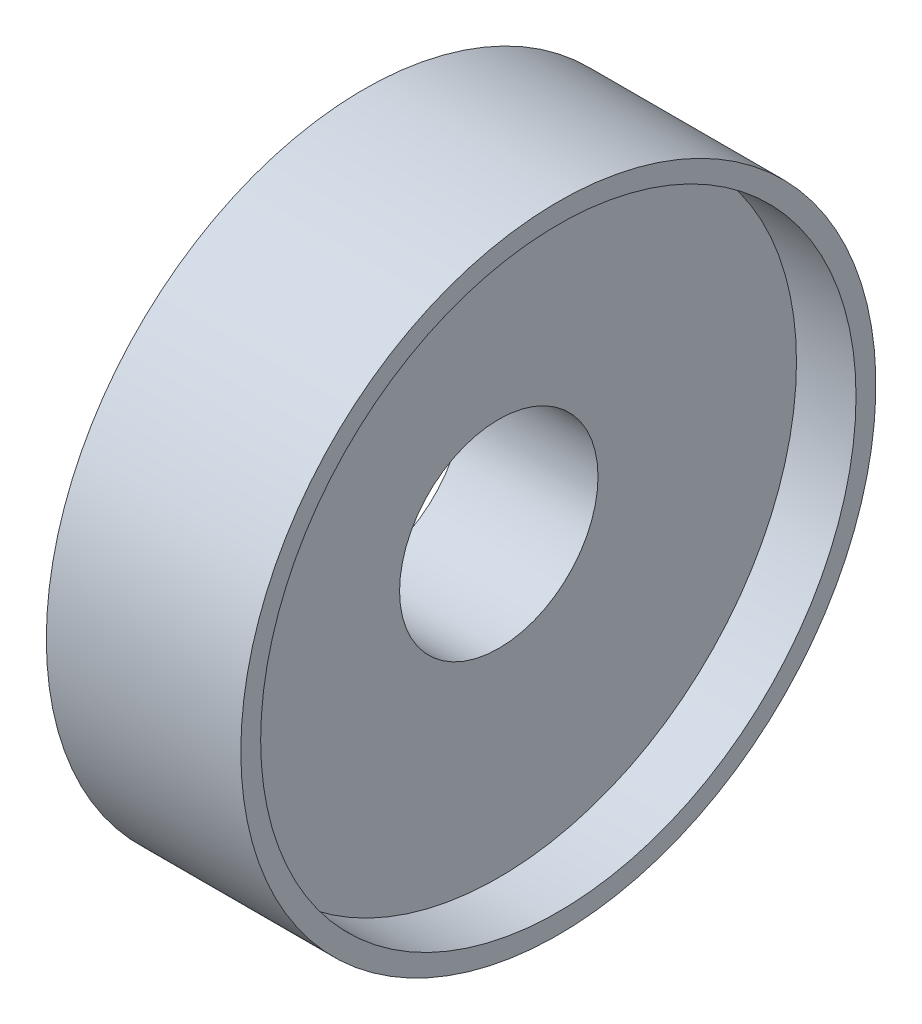
ISO-10303-21;
HEADER;
FILE_DESCRIPTION(('STEP AP214'),'2;1');
FILE_NAME('part.step','',(''),(''),'','','');
FILE_SCHEMA(('AUTOMOTIVE_DESIGN { 1 0 10303 214 1 1 1 1 }'));
ENDSEC;
DATA;
#1=APPLICATION_CONTEXT('core data for automotive mechanical design processes');
#2=APPLICATION_PROTOCOL_DEFINITION('international standard','automotive_design',2000,#1);
#3=PRODUCT_CONTEXT('',#1,'mechanical');
#4=PRODUCT('Part','Part','',(#3));
#5=PRODUCT_RELATED_PRODUCT_CATEGORY('part','',(#4));
#6=PRODUCT_DEFINITION_FORMATION('','',#4);
#7=PRODUCT_DEFINITION_CONTEXT('part definition',#1,'design');
#8=PRODUCT_DEFINITION('design','',#6,#7);
#9=PRODUCT_DEFINITION_SHAPE('','',#8);
#10=(LENGTH_UNIT() NAMED_UNIT(*) SI_UNIT(.MILLI.,.METRE.));
#11=(NAMED_UNIT(*) PLANE_ANGLE_UNIT() SI_UNIT($,.RADIAN.));
#12=(NAMED_UNIT(*) SI_UNIT($,.STERADIAN.) SOLID_ANGLE_UNIT());
#13=UNCERTAINTY_MEASURE_WITH_UNIT(LENGTH_MEASURE(1.E-05),#10,'distance_accuracy_value','');
#14=(GEOMETRIC_REPRESENTATION_CONTEXT(3) GLOBAL_UNCERTAINTY_ASSIGNED_CONTEXT((#13)) GLOBAL_UNIT_ASSIGNED_CONTEXT((#10,
#11,#12)) REPRESENTATION_CONTEXT('',''));
#15=CARTESIAN_POINT('',(0.,0.,0.));
#16=DIRECTION('',(0.,0.,1.));
#17=DIRECTION('',(1.,0.,0.));
#18=AXIS2_PLACEMENT_3D('',#15,#16,#17);
#19=CARTESIAN_POINT('',(21.45,0.,0.));
#20=DIRECTION('',(-1.,0.,0.));
#21=DIRECTION('',(0.,0.,1.));
#22=AXIS2_PLACEMENT_3D('',#19,#20,#21);
#23=CYLINDRICAL_SURFACE('',#22,7.5);
#24=CARTESIAN_POINT('',(20.7,0.,0.));
#25=DIRECTION('',(-1.,0.,0.));
#26=DIRECTION('',(0.,0.,1.));
#27=AXIS2_PLACEMENT_3D('',#24,#25,#26);
#28=CIRCLE('',#27,7.5);
#29=CARTESIAN_POINT('',(20.7,0.,7.5));
#30=VERTEX_POINT('',#29);
#31=EDGE_CURVE('E33',#30,#30,#28,.F.);
#32=ORIENTED_EDGE('',*,*,#31,.F.);
#33=EDGE_LOOP('',(#32));
#34=FACE_BOUND('',#33,.T.);
#35=CARTESIAN_POINT('',(22.2,0.,0.));
#36=DIRECTION('',(-1.,0.,0.));
#37=DIRECTION('',(0.,0.,1.));
#38=AXIS2_PLACEMENT_3D('',#35,#36,#37);
#39=CIRCLE('',#38,7.5);
#40=CARTESIAN_POINT('',(22.2,0.,7.5));
#41=VERTEX_POINT('',#40);
#42=EDGE_CURVE('E17',#41,#41,#39,.T.);
#43=ORIENTED_EDGE('',*,*,#42,.F.);
#44=EDGE_LOOP('',(#43));
#45=FACE_BOUND('',#44,.T.);
#46=ADVANCED_FACE('F14',(#34,#45),#23,.F.);
#47=CARTESIAN_POINT('',(22.2,7.75,0.));
#48=DIRECTION('',(1.,0.,0.));
#49=DIRECTION('',(0.,0.,-1.));
#50=AXIS2_PLACEMENT_3D('',#47,#48,#49);
#51=PLANE('',#50);
#52=CARTESIAN_POINT('',(22.2,0.,0.));
#53=DIRECTION('',(-1.,0.,0.));
#54=DIRECTION('',(0.,0.,1.));
#55=AXIS2_PLACEMENT_3D('',#52,#53,#54);
#56=CIRCLE('',#55,8.);
#57=CARTESIAN_POINT('',(22.2,0.,8.));
#58=VERTEX_POINT('',#57);
#59=EDGE_CURVE('E31',#58,#58,#56,.T.);
#60=ORIENTED_EDGE('',*,*,#59,.F.);
#61=EDGE_LOOP('',(#60));
#62=FACE_BOUND('',#61,.T.);
#63=ORIENTED_EDGE('',*,*,#42,.T.);
#64=EDGE_LOOP('',(#63));
#65=FACE_BOUND('',#64,.T.);
#66=ADVANCED_FACE('F40',(#62,#65),#51,.T.);
#67=CARTESIAN_POINT('',(20.7,5.,0.));
#68=DIRECTION('',(1.,0.,0.));
#69=DIRECTION('',(0.,0.,-1.));
#70=AXIS2_PLACEMENT_3D('',#67,#68,#69);
#71=PLANE('',#70);
#72=ORIENTED_EDGE('',*,*,#31,.T.);
#73=EDGE_LOOP('',(#72));
#74=FACE_BOUND('',#73,.T.);
#75=CARTESIAN_POINT('',(20.7,0.,0.));
#76=DIRECTION('',(-1.,0.,0.));
#77=DIRECTION('',(0.,0.,1.));
#78=AXIS2_PLACEMENT_3D('',#75,#76,#77);
#79=CIRCLE('',#78,2.5);
#80=CARTESIAN_POINT('',(20.7,0.,2.5));
#81=VERTEX_POINT('',#80);
#82=EDGE_CURVE('E26',#81,#81,#79,.T.);
#83=ORIENTED_EDGE('',*,*,#82,.T.);
#84=EDGE_LOOP('',(#83));
#85=FACE_BOUND('',#84,.T.);
#86=ADVANCED_FACE('F50',(#74,#85),#71,.T.);
#87=CARTESIAN_POINT('',(19.75,0.,0.));
#88=DIRECTION('',(-1.,0.,0.));
#89=DIRECTION('',(0.,0.,1.));
#90=AXIS2_PLACEMENT_3D('',#87,#88,#89);
#91=CYLINDRICAL_SURFACE('',#90,8.);
#92=ORIENTED_EDGE('',*,*,#59,.T.);
#93=EDGE_LOOP('',(#92));
#94=FACE_BOUND('',#93,.T.);
#95=CARTESIAN_POINT('',(17.3,0.,0.));
#96=DIRECTION('',(-1.,0.,0.));
#97=DIRECTION('',(0.,0.,1.));
#98=AXIS2_PLACEMENT_3D('',#95,#96,#97);
#99=CIRCLE('',#98,8.);
#100=CARTESIAN_POINT('',(17.3,0.,8.));
#101=VERTEX_POINT('',#100);
#102=EDGE_CURVE('E21',#101,#101,#99,.T.);
#103=ORIENTED_EDGE('',*,*,#102,.F.);
#104=EDGE_LOOP('',(#103));
#105=FACE_BOUND('',#104,.T.);
#106=ADVANCED_FACE('F60',(#94,#105),#91,.T.);
#107=CARTESIAN_POINT('',(19.,0.,0.));
#108=DIRECTION('',(-1.,0.,0.));
#109=DIRECTION('',(0.,0.,1.));
#110=AXIS2_PLACEMENT_3D('',#107,#108,#109);
#111=CYLINDRICAL_SURFACE('',#110,2.5);
#112=CARTESIAN_POINT('',(17.3,0.,0.));
#113=DIRECTION('',(-1.,0.,0.));
#114=DIRECTION('',(0.,0.,1.));
#115=AXIS2_PLACEMENT_3D('',#112,#113,#114);
#116=CIRCLE('',#115,2.5);
#117=CARTESIAN_POINT('',(17.3,0.,2.5));
#118=VERTEX_POINT('',#117);
#119=EDGE_CURVE('E10',#118,#118,#116,.F.);
#120=ORIENTED_EDGE('',*,*,#119,.F.);
#121=EDGE_LOOP('',(#120));
#122=FACE_BOUND('',#121,.T.);
#123=ORIENTED_EDGE('',*,*,#82,.F.);
#124=EDGE_LOOP('',(#123));
#125=FACE_BOUND('',#124,.T.);
#126=ADVANCED_FACE('F54',(#122,#125),#111,.F.);
#127=CARTESIAN_POINT('',(17.3,5.25,0.));
#128=DIRECTION('',(-1.,0.,0.));
#129=DIRECTION('',(0.,0.,1.));
#130=AXIS2_PLACEMENT_3D('',#127,#128,#129);
#131=PLANE('',#130);
#132=ORIENTED_EDGE('',*,*,#119,.T.);
#133=EDGE_LOOP('',(#132));
#134=FACE_BOUND('',#133,.T.);
#135=ORIENTED_EDGE('',*,*,#102,.T.);
#136=EDGE_LOOP('',(#135));
#137=FACE_BOUND('',#136,.T.);
#138=ADVANCED_FACE('F52',(#134,#137),#131,.T.);
#139=CLOSED_SHELL('',(#46,#66,#86,#106,#126,#138));
#140=MANIFOLD_SOLID_BREP('B1',#139);
#141=ADVANCED_BREP_SHAPE_REPRESENTATION('',(#18,#140),#14);
#142=SHAPE_DEFINITION_REPRESENTATION(#9,#141);
ENDSEC;
END-ISO-10303-21;
